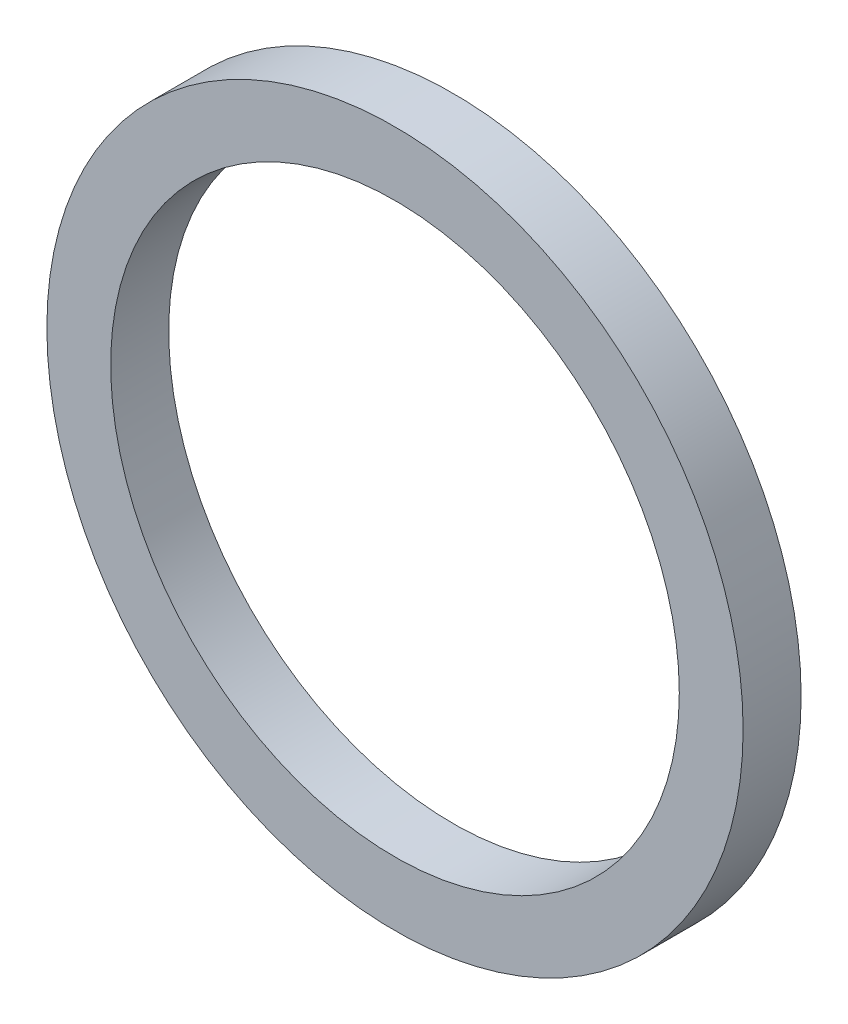
ISO-10303-21;
HEADER;
FILE_DESCRIPTION(('STEP AP214'),'2;1');
FILE_NAME('part.step','',(''),(''),'','','');
FILE_SCHEMA(('AUTOMOTIVE_DESIGN { 1 0 10303 214 1 1 1 1 }'));
ENDSEC;
DATA;
#1=APPLICATION_CONTEXT('core data for automotive mechanical design processes');
#2=APPLICATION_PROTOCOL_DEFINITION('international standard','automotive_design',2000,#1);
#3=PRODUCT_CONTEXT('',#1,'mechanical');
#4=PRODUCT('Part','Part','',(#3));
#5=PRODUCT_RELATED_PRODUCT_CATEGORY('part','',(#4));
#6=PRODUCT_DEFINITION_FORMATION('','',#4);
#7=PRODUCT_DEFINITION_CONTEXT('part definition',#1,'design');
#8=PRODUCT_DEFINITION('design','',#6,#7);
#9=PRODUCT_DEFINITION_SHAPE('','',#8);
#10=(LENGTH_UNIT() NAMED_UNIT(*) SI_UNIT(.MILLI.,.METRE.));
#11=(NAMED_UNIT(*) PLANE_ANGLE_UNIT() SI_UNIT($,.RADIAN.));
#12=(NAMED_UNIT(*) SI_UNIT($,.STERADIAN.) SOLID_ANGLE_UNIT());
#13=UNCERTAINTY_MEASURE_WITH_UNIT(LENGTH_MEASURE(1.E-05),#10,'distance_accuracy_value','');
#14=(GEOMETRIC_REPRESENTATION_CONTEXT(3) GLOBAL_UNCERTAINTY_ASSIGNED_CONTEXT((#13)) GLOBAL_UNIT_ASSIGNED_CONTEXT((#10,
#11,#12)) REPRESENTATION_CONTEXT('',''));
#15=CARTESIAN_POINT('',(0.,0.,0.));
#16=DIRECTION('',(0.,0.,1.));
#17=DIRECTION('',(1.,0.,0.));
#18=AXIS2_PLACEMENT_3D('',#15,#16,#17);
#19=CARTESIAN_POINT('',(0.,0.,1.5875));
#20=DIRECTION('',(0.,0.,1.));
#21=DIRECTION('',(1.,0.,0.));
#22=AXIS2_PLACEMENT_3D('',#19,#20,#21);
#23=PLANE('',#22);
#24=CARTESIAN_POINT('',(0.,0.,1.5875));
#25=DIRECTION('',(0.,0.,1.));
#26=DIRECTION('',(1.,0.,0.));
#27=AXIS2_PLACEMENT_3D('',#24,#25,#26);
#28=CIRCLE('',#27,19.05);
#29=CARTESIAN_POINT('',(19.05,0.,1.5875));
#30=VERTEX_POINT('',#29);
#31=EDGE_CURVE('E10',#30,#30,#28,.T.);
#32=ORIENTED_EDGE('',*,*,#31,.T.);
#33=EDGE_LOOP('',(#32));
#34=FACE_BOUND('',#33,.T.);
#35=CARTESIAN_POINT('',(0.,0.,1.5875));
#36=DIRECTION('',(0.,0.,1.));
#37=DIRECTION('',(1.,0.,0.));
#38=AXIS2_PLACEMENT_3D('',#35,#36,#37);
#39=CIRCLE('',#38,15.5575);
#40=CARTESIAN_POINT('',(15.5575,0.,1.5875));
#41=VERTEX_POINT('',#40);
#42=EDGE_CURVE('E42',#41,#41,#39,.T.);
#43=ORIENTED_EDGE('',*,*,#42,.F.);
#44=EDGE_LOOP('',(#43));
#45=FACE_BOUND('',#44,.T.);
#46=ADVANCED_FACE('F31',(#34,#45),#23,.T.);
#47=CARTESIAN_POINT('',(0.,0.,-1.5875));
#48=DIRECTION('',(0.,0.,1.));
#49=DIRECTION('',(1.,0.,0.));
#50=AXIS2_PLACEMENT_3D('',#47,#48,#49);
#51=PLANE('',#50);
#52=CARTESIAN_POINT('',(0.,0.,-1.5875));
#53=DIRECTION('',(0.,0.,1.));
#54=DIRECTION('',(1.,0.,0.));
#55=AXIS2_PLACEMENT_3D('',#52,#53,#54);
#56=CIRCLE('',#55,19.05);
#57=CARTESIAN_POINT('',(19.05,0.,-1.5875));
#58=VERTEX_POINT('',#57);
#59=EDGE_CURVE('E35',#58,#58,#56,.T.);
#60=ORIENTED_EDGE('',*,*,#59,.F.);
#61=EDGE_LOOP('',(#60));
#62=FACE_BOUND('',#61,.T.);
#63=CARTESIAN_POINT('',(0.,0.,-1.5875));
#64=DIRECTION('',(0.,0.,1.));
#65=DIRECTION('',(1.,0.,0.));
#66=AXIS2_PLACEMENT_3D('',#63,#64,#65);
#67=CIRCLE('',#66,15.5575);
#68=CARTESIAN_POINT('',(15.5575,0.,-1.5875));
#69=VERTEX_POINT('',#68);
#70=EDGE_CURVE('E44',#69,#69,#67,.T.);
#71=ORIENTED_EDGE('',*,*,#70,.T.);
#72=EDGE_LOOP('',(#71));
#73=FACE_BOUND('',#72,.T.);
#74=ADVANCED_FACE('F54',(#62,#73),#51,.F.);
#75=CARTESIAN_POINT('',(0.,0.,1.5875));
#76=DIRECTION('',(0.,0.,-1.));
#77=DIRECTION('',(-1.,0.,0.));
#78=AXIS2_PLACEMENT_3D('',#75,#76,#77);
#79=CYLINDRICAL_SURFACE('',#78,19.05);
#80=ORIENTED_EDGE('',*,*,#31,.F.);
#81=EDGE_LOOP('',(#80));
#82=FACE_BOUND('',#81,.T.);
#83=ORIENTED_EDGE('',*,*,#59,.T.);
#84=EDGE_LOOP('',(#83));
#85=FACE_BOUND('',#84,.T.);
#86=ADVANCED_FACE('F33',(#82,#85),#79,.T.);
#87=CARTESIAN_POINT('',(0.,0.,1.5875));
#88=DIRECTION('',(0.,0.,-1.));
#89=DIRECTION('',(-1.,0.,0.));
#90=AXIS2_PLACEMENT_3D('',#87,#88,#89);
#91=CYLINDRICAL_SURFACE('',#90,15.5575);
#92=ORIENTED_EDGE('',*,*,#42,.T.);
#93=EDGE_LOOP('',(#92));
#94=FACE_BOUND('',#93,.T.);
#95=ORIENTED_EDGE('',*,*,#70,.F.);
#96=EDGE_LOOP('',(#95));
#97=FACE_BOUND('',#96,.T.);
#98=ADVANCED_FACE('F50',(#94,#97),#91,.F.);
#99=CLOSED_SHELL('',(#46,#74,#86,#98));
#100=MANIFOLD_SOLID_BREP('B2',#99);
#101=ADVANCED_BREP_SHAPE_REPRESENTATION('',(#18,#100),#14);
#102=SHAPE_DEFINITION_REPRESENTATION(#9,#101);
ENDSEC;
END-ISO-10303-21;
